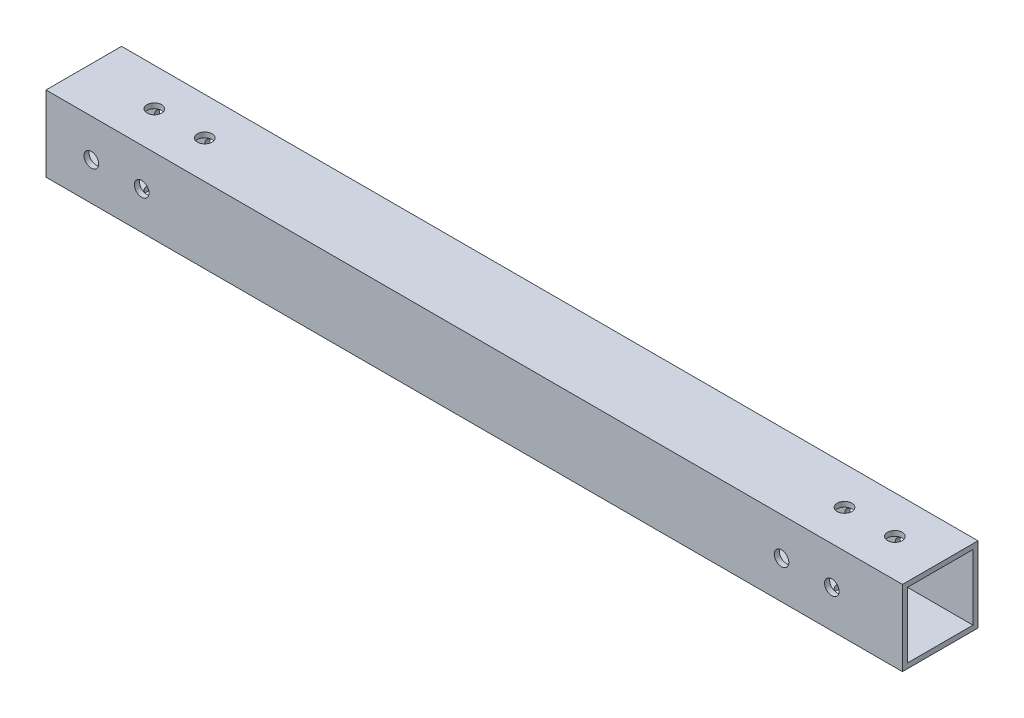
ISO-10303-21;
HEADER;
FILE_DESCRIPTION(('STEP AP214'),'2;1');
FILE_NAME('part.step','',(''),(''),'','','');
FILE_SCHEMA(('AUTOMOTIVE_DESIGN { 1 0 10303 214 1 1 1 1 }'));
ENDSEC;
DATA;
#1=APPLICATION_CONTEXT('core data for automotive mechanical design processes');
#2=APPLICATION_PROTOCOL_DEFINITION('international standard','automotive_design',2000,#1);
#3=PRODUCT_CONTEXT('',#1,'mechanical');
#4=PRODUCT('Part','Part','',(#3));
#5=PRODUCT_RELATED_PRODUCT_CATEGORY('part','',(#4));
#6=PRODUCT_DEFINITION_FORMATION('','',#4);
#7=PRODUCT_DEFINITION_CONTEXT('part definition',#1,'design');
#8=PRODUCT_DEFINITION('design','',#6,#7);
#9=PRODUCT_DEFINITION_SHAPE('','',#8);
#10=(LENGTH_UNIT() NAMED_UNIT(*) SI_UNIT(.MILLI.,.METRE.));
#11=(NAMED_UNIT(*) PLANE_ANGLE_UNIT() SI_UNIT($,.RADIAN.));
#12=(NAMED_UNIT(*) SI_UNIT($,.STERADIAN.) SOLID_ANGLE_UNIT());
#13=UNCERTAINTY_MEASURE_WITH_UNIT(LENGTH_MEASURE(1.E-05),#10,'distance_accuracy_value','');
#14=(GEOMETRIC_REPRESENTATION_CONTEXT(3) GLOBAL_UNCERTAINTY_ASSIGNED_CONTEXT((#13)) GLOBAL_UNIT_ASSIGNED_CONTEXT((#10,
#11,#12)) REPRESENTATION_CONTEXT('',''));
#15=CARTESIAN_POINT('',(0.,0.,0.));
#16=DIRECTION('',(0.,0.,1.));
#17=DIRECTION('',(1.,0.,0.));
#18=AXIS2_PLACEMENT_3D('',#15,#16,#17);
#19=CARTESIAN_POINT('',(170.,0.,0.));
#20=DIRECTION('',(-1.,0.,0.));
#21=DIRECTION('',(0.,0.,1.));
#22=AXIS2_PLACEMENT_3D('',#19,#20,#21);
#23=PLANE('',#22);
#24=DIRECTION('',(0.,1.,0.));
#25=VECTOR('',#24,1.);
#26=CARTESIAN_POINT('',(170.,-7.5,-7.5));
#27=LINE('',#26,#25);
#28=CARTESIAN_POINT('',(170.,-7.5,-7.5));
#29=VERTEX_POINT('',#28);
#30=CARTESIAN_POINT('',(170.,7.5,-7.5));
#31=VERTEX_POINT('',#30);
#32=EDGE_CURVE('E146',#29,#31,#27,.T.);
#33=ORIENTED_EDGE('',*,*,#32,.T.);
#34=DIRECTION('',(0.,0.,1.));
#35=VECTOR('',#34,1.);
#36=CARTESIAN_POINT('',(170.,7.5,7.5));
#37=LINE('',#36,#35);
#38=CARTESIAN_POINT('',(170.,7.5,7.5));
#39=VERTEX_POINT('',#38);
#40=EDGE_CURVE('E149',#31,#39,#37,.T.);
#41=ORIENTED_EDGE('',*,*,#40,.T.);
#42=DIRECTION('',(0.,-1.,0.));
#43=VECTOR('',#42,1.);
#44=CARTESIAN_POINT('',(170.,-7.5,7.5));
#45=LINE('',#44,#43);
#46=CARTESIAN_POINT('',(170.,-7.5,7.5));
#47=VERTEX_POINT('',#46);
#48=EDGE_CURVE('E152',#39,#47,#45,.T.);
#49=ORIENTED_EDGE('',*,*,#48,.T.);
#50=DIRECTION('',(0.,0.,-1.));
#51=VECTOR('',#50,1.);
#52=CARTESIAN_POINT('',(170.,-7.5,7.5));
#53=LINE('',#52,#51);
#54=EDGE_CURVE('E154',#47,#29,#53,.T.);
#55=ORIENTED_EDGE('',*,*,#54,.T.);
#56=EDGE_LOOP('',(#33,#41,#49,#55));
#57=FACE_BOUND('',#56,.T.);
#58=DIRECTION('',(0.,0.,-1.));
#59=VECTOR('',#58,1.);
#60=CARTESIAN_POINT('',(170.,-6.5,6.5));
#61=LINE('',#60,#59);
#62=CARTESIAN_POINT('',(170.,-6.5,6.5));
#63=VERTEX_POINT('',#62);
#64=CARTESIAN_POINT('',(170.,-6.5,-6.5));
#65=VERTEX_POINT('',#64);
#66=EDGE_CURVE('E108',#63,#65,#61,.T.);
#67=ORIENTED_EDGE('',*,*,#66,.F.);
#68=DIRECTION('',(0.,-1.,0.));
#69=VECTOR('',#68,1.);
#70=CARTESIAN_POINT('',(170.,-6.5,6.5));
#71=LINE('',#70,#69);
#72=CARTESIAN_POINT('',(170.,6.5,6.5));
#73=VERTEX_POINT('',#72);
#74=EDGE_CURVE('E130',#73,#63,#71,.T.);
#75=ORIENTED_EDGE('',*,*,#74,.F.);
#76=DIRECTION('',(0.,0.,1.));
#77=VECTOR('',#76,1.);
#78=CARTESIAN_POINT('',(170.,6.5,6.5));
#79=LINE('',#78,#77);
#80=CARTESIAN_POINT('',(170.,6.5,-6.5));
#81=VERTEX_POINT('',#80);
#82=EDGE_CURVE('E128',#81,#73,#79,.T.);
#83=ORIENTED_EDGE('',*,*,#82,.F.);
#84=DIRECTION('',(0.,1.,0.));
#85=VECTOR('',#84,1.);
#86=CARTESIAN_POINT('',(170.,-6.5,-6.5));
#87=LINE('',#86,#85);
#88=EDGE_CURVE('E116',#65,#81,#87,.T.);
#89=ORIENTED_EDGE('',*,*,#88,.F.);
#90=EDGE_LOOP('',(#67,#75,#83,#89));
#91=FACE_BOUND('',#90,.T.);
#92=ADVANCED_FACE('F41',(#57,#91),#23,.F.);
#93=CARTESIAN_POINT('',(0.,0.,0.));
#94=DIRECTION('',(-1.,0.,0.));
#95=DIRECTION('',(0.,0.,1.));
#96=AXIS2_PLACEMENT_3D('',#93,#94,#95);
#97=PLANE('',#96);
#98=DIRECTION('',(0.,1.,0.));
#99=VECTOR('',#98,1.);
#100=CARTESIAN_POINT('',(0.,-7.5,-7.5));
#101=LINE('',#100,#99);
#102=CARTESIAN_POINT('',(0.,-7.5,-7.5));
#103=VERTEX_POINT('',#102);
#104=CARTESIAN_POINT('',(0.,7.5,-7.5));
#105=VERTEX_POINT('',#104);
#106=EDGE_CURVE('E124',#103,#105,#101,.T.);
#107=ORIENTED_EDGE('',*,*,#106,.F.);
#108=DIRECTION('',(0.,0.,-1.));
#109=VECTOR('',#108,1.);
#110=CARTESIAN_POINT('',(0.,-7.5,7.5));
#111=LINE('',#110,#109);
#112=CARTESIAN_POINT('',(0.,-7.5,7.5));
#113=VERTEX_POINT('',#112);
#114=EDGE_CURVE('E150',#113,#103,#111,.T.);
#115=ORIENTED_EDGE('',*,*,#114,.F.);
#116=DIRECTION('',(0.,-1.,0.));
#117=VECTOR('',#116,1.);
#118=CARTESIAN_POINT('',(0.,-7.5,7.5));
#119=LINE('',#118,#117);
#120=CARTESIAN_POINT('',(0.,7.5,7.5));
#121=VERTEX_POINT('',#120);
#122=EDGE_CURVE('E161',#121,#113,#119,.T.);
#123=ORIENTED_EDGE('',*,*,#122,.F.);
#124=DIRECTION('',(0.,0.,1.));
#125=VECTOR('',#124,1.);
#126=CARTESIAN_POINT('',(0.,7.5,7.5));
#127=LINE('',#126,#125);
#128=EDGE_CURVE('E159',#105,#121,#127,.T.);
#129=ORIENTED_EDGE('',*,*,#128,.F.);
#130=EDGE_LOOP('',(#107,#115,#123,#129));
#131=FACE_BOUND('',#130,.T.);
#132=DIRECTION('',(0.,-1.,0.));
#133=VECTOR('',#132,1.);
#134=CARTESIAN_POINT('',(0.,-6.5,6.5));
#135=LINE('',#134,#133);
#136=CARTESIAN_POINT('',(0.,6.5,6.5));
#137=VERTEX_POINT('',#136);
#138=CARTESIAN_POINT('',(0.,-6.5,6.5));
#139=VERTEX_POINT('',#138);
#140=EDGE_CURVE('E117',#137,#139,#135,.T.);
#141=ORIENTED_EDGE('',*,*,#140,.T.);
#142=DIRECTION('',(0.,0.,-1.));
#143=VECTOR('',#142,1.);
#144=CARTESIAN_POINT('',(0.,-6.5,6.5));
#145=LINE('',#144,#143);
#146=CARTESIAN_POINT('',(0.,-6.5,-6.5));
#147=VERTEX_POINT('',#146);
#148=EDGE_CURVE('E66',#139,#147,#145,.T.);
#149=ORIENTED_EDGE('',*,*,#148,.T.);
#150=DIRECTION('',(0.,1.,0.));
#151=VECTOR('',#150,1.);
#152=CARTESIAN_POINT('',(0.,-6.5,-6.5));
#153=LINE('',#152,#151);
#154=CARTESIAN_POINT('',(0.,6.5,-6.5));
#155=VERTEX_POINT('',#154);
#156=EDGE_CURVE('E123',#147,#155,#153,.T.);
#157=ORIENTED_EDGE('',*,*,#156,.T.);
#158=DIRECTION('',(0.,0.,1.));
#159=VECTOR('',#158,1.);
#160=CARTESIAN_POINT('',(0.,6.5,6.5));
#161=LINE('',#160,#159);
#162=EDGE_CURVE('E138',#155,#137,#161,.T.);
#163=ORIENTED_EDGE('',*,*,#162,.T.);
#164=EDGE_LOOP('',(#141,#149,#157,#163));
#165=FACE_BOUND('',#164,.T.);
#166=ADVANCED_FACE('F268',(#131,#165),#97,.T.);
#167=CARTESIAN_POINT('',(170.,-7.5,-7.5));
#168=DIRECTION('',(0.,0.,1.));
#169=DIRECTION('',(1.,0.,0.));
#170=AXIS2_PLACEMENT_3D('',#167,#168,#169);
#171=PLANE('',#170);
#172=CARTESIAN_POINT('',(8.99999999999831,2.80157841370254E-13,-7.5));
#173=DIRECTION('',(0.,0.,-1.));
#174=DIRECTION('',(-1.,0.,0.));
#175=AXIS2_PLACEMENT_3D('',#172,#173,#174);
#176=CIRCLE('',#175,1.45);
#177=CARTESIAN_POINT('',(7.54999999999831,2.80157841370254E-13,-7.5));
#178=VERTEX_POINT('',#177);
#179=EDGE_CURVE('E215',#178,#178,#176,.T.);
#180=ORIENTED_EDGE('',*,*,#179,.F.);
#181=EDGE_LOOP('',(#180));
#182=FACE_BOUND('',#181,.T.);
#183=CARTESIAN_POINT('',(18.9999999999983,2.80157841370254E-13,-7.5));
#184=DIRECTION('',(0.,0.,-1.));
#185=DIRECTION('',(-1.,0.,0.));
#186=AXIS2_PLACEMENT_3D('',#183,#184,#185);
#187=CIRCLE('',#186,1.45);
#188=CARTESIAN_POINT('',(17.5499999999983,2.80157841370254E-13,-7.5));
#189=VERTEX_POINT('',#188);
#190=EDGE_CURVE('E218',#189,#189,#187,.T.);
#191=ORIENTED_EDGE('',*,*,#190,.F.);
#192=EDGE_LOOP('',(#191));
#193=FACE_BOUND('',#192,.T.);
#194=CARTESIAN_POINT('',(146.,2.8275992658422E-13,-7.5));
#195=DIRECTION('',(0.,0.,-1.));
#196=DIRECTION('',(-1.,0.,0.));
#197=AXIS2_PLACEMENT_3D('',#194,#195,#196);
#198=CIRCLE('',#197,1.45);
#199=CARTESIAN_POINT('',(144.55,2.8275992658422E-13,-7.5));
#200=VERTEX_POINT('',#199);
#201=EDGE_CURVE('E224',#200,#200,#198,.T.);
#202=ORIENTED_EDGE('',*,*,#201,.F.);
#203=EDGE_LOOP('',(#202));
#204=FACE_BOUND('',#203,.T.);
#205=CARTESIAN_POINT('',(156.,2.8275992658422E-13,-7.5));
#206=DIRECTION('',(0.,0.,-1.));
#207=DIRECTION('',(-1.,0.,0.));
#208=AXIS2_PLACEMENT_3D('',#205,#206,#207);
#209=CIRCLE('',#208,1.45);
#210=CARTESIAN_POINT('',(154.55,2.8275992658422E-13,-7.5));
#211=VERTEX_POINT('',#210);
#212=EDGE_CURVE('E230',#211,#211,#209,.T.);
#213=ORIENTED_EDGE('',*,*,#212,.F.);
#214=EDGE_LOOP('',(#213));
#215=FACE_BOUND('',#214,.T.);
#216=ORIENTED_EDGE('',*,*,#106,.T.);
#217=DIRECTION('',(-1.,0.,0.));
#218=VECTOR('',#217,1.);
#219=CARTESIAN_POINT('',(170.,7.5,-7.5));
#220=LINE('',#219,#218);
#221=EDGE_CURVE('E11',#31,#105,#220,.T.);
#222=ORIENTED_EDGE('',*,*,#221,.F.);
#223=ORIENTED_EDGE('',*,*,#32,.F.);
#224=DIRECTION('',(-1.,0.,0.));
#225=VECTOR('',#224,1.);
#226=CARTESIAN_POINT('',(170.,-7.5,-7.5));
#227=LINE('',#226,#225);
#228=EDGE_CURVE('E156',#29,#103,#227,.T.);
#229=ORIENTED_EDGE('',*,*,#228,.T.);
#230=EDGE_LOOP('',(#216,#222,#223,#229));
#231=FACE_BOUND('',#230,.T.);
#232=ADVANCED_FACE('F43',(#182,#193,#204,#215,#231),#171,.F.);
#233=CARTESIAN_POINT('',(170.,7.5,7.5));
#234=DIRECTION('',(0.,-1.,0.));
#235=DIRECTION('',(0.,0.,-1.));
#236=AXIS2_PLACEMENT_3D('',#233,#234,#235);
#237=PLANE('',#236);
#238=CARTESIAN_POINT('',(161.,7.5,-4.32986979603811E-12));
#239=DIRECTION('',(0.,1.,0.));
#240=DIRECTION('',(0.,0.,1.));
#241=AXIS2_PLACEMENT_3D('',#238,#239,#240);
#242=CIRCLE('',#241,1.45);
#243=CARTESIAN_POINT('',(161.,7.5,1.44999999999567));
#244=VERTEX_POINT('',#243);
#245=EDGE_CURVE('E364',#244,#244,#242,.T.);
#246=ORIENTED_EDGE('',*,*,#245,.F.);
#247=EDGE_LOOP('',(#246));
#248=FACE_BOUND('',#247,.T.);
#249=CARTESIAN_POINT('',(151.,7.5,-4.32553298734817E-12));
#250=DIRECTION('',(0.,1.,0.));
#251=DIRECTION('',(0.,0.,1.));
#252=AXIS2_PLACEMENT_3D('',#249,#250,#251);
#253=CIRCLE('',#252,1.45);
#254=CARTESIAN_POINT('',(151.,7.5,1.44999999999567));
#255=VERTEX_POINT('',#254);
#256=EDGE_CURVE('E372',#255,#255,#253,.T.);
#257=ORIENTED_EDGE('',*,*,#256,.F.);
#258=EDGE_LOOP('',(#257));
#259=FACE_BOUND('',#258,.T.);
#260=CARTESIAN_POINT('',(23.9999999999981,7.5,-4.23185791964542E-12));
#261=DIRECTION('',(0.,1.,0.));
#262=DIRECTION('',(0.,0.,1.));
#263=AXIS2_PLACEMENT_3D('',#260,#261,#262);
#264=CIRCLE('',#263,1.45);
#265=CARTESIAN_POINT('',(23.9999999999981,7.5,1.44999999999577));
#266=VERTEX_POINT('',#265);
#267=EDGE_CURVE('E378',#266,#266,#264,.T.);
#268=ORIENTED_EDGE('',*,*,#267,.F.);
#269=EDGE_LOOP('',(#268));
#270=FACE_BOUND('',#269,.T.);
#271=CARTESIAN_POINT('',(13.9999999999981,7.5,-4.23099055790743E-12));
#272=DIRECTION('',(0.,1.,0.));
#273=DIRECTION('',(0.,0.,1.));
#274=AXIS2_PLACEMENT_3D('',#271,#272,#273);
#275=CIRCLE('',#274,1.45);
#276=CARTESIAN_POINT('',(13.9999999999981,7.5,1.44999999999577));
#277=VERTEX_POINT('',#276);
#278=EDGE_CURVE('E383',#277,#277,#275,.T.);
#279=ORIENTED_EDGE('',*,*,#278,.F.);
#280=EDGE_LOOP('',(#279));
#281=FACE_BOUND('',#280,.T.);
#282=ORIENTED_EDGE('',*,*,#128,.T.);
#283=DIRECTION('',(-1.,0.,0.));
#284=VECTOR('',#283,1.);
#285=CARTESIAN_POINT('',(170.,7.5,7.5));
#286=LINE('',#285,#284);
#287=EDGE_CURVE('E50',#39,#121,#286,.T.);
#288=ORIENTED_EDGE('',*,*,#287,.F.);
#289=ORIENTED_EDGE('',*,*,#40,.F.);
#290=ORIENTED_EDGE('',*,*,#221,.T.);
#291=EDGE_LOOP('',(#282,#288,#289,#290));
#292=FACE_BOUND('',#291,.T.);
#293=ADVANCED_FACE('F267',(#248,#259,#270,#281,#292),#237,.F.);
#294=CARTESIAN_POINT('',(170.,-7.5,7.5));
#295=DIRECTION('',(0.,0.,-1.));
#296=DIRECTION('',(-1.,0.,0.));
#297=AXIS2_PLACEMENT_3D('',#294,#295,#296);
#298=PLANE('',#297);
#299=CARTESIAN_POINT('',(8.99999999999831,2.80157841370254E-13,7.5));
#300=DIRECTION('',(0.,0.,-1.));
#301=DIRECTION('',(-1.,0.,0.));
#302=AXIS2_PLACEMENT_3D('',#299,#300,#301);
#303=CIRCLE('',#302,1.45);
#304=CARTESIAN_POINT('',(7.54999999999831,2.80157841370254E-13,7.5));
#305=VERTEX_POINT('',#304);
#306=EDGE_CURVE('E175',#305,#305,#303,.T.);
#307=ORIENTED_EDGE('',*,*,#306,.T.);
#308=EDGE_LOOP('',(#307));
#309=FACE_BOUND('',#308,.T.);
#310=CARTESIAN_POINT('',(18.9999999999983,2.80157841370254E-13,7.5));
#311=DIRECTION('',(0.,0.,-1.));
#312=DIRECTION('',(-1.,0.,0.));
#313=AXIS2_PLACEMENT_3D('',#310,#311,#312);
#314=CIRCLE('',#313,1.45);
#315=CARTESIAN_POINT('',(17.5499999999983,2.80157841370254E-13,7.5));
#316=VERTEX_POINT('',#315);
#317=EDGE_CURVE('E221',#316,#316,#314,.T.);
#318=ORIENTED_EDGE('',*,*,#317,.T.);
#319=EDGE_LOOP('',(#318));
#320=FACE_BOUND('',#319,.T.);
#321=CARTESIAN_POINT('',(146.,2.8275992658422E-13,7.5));
#322=DIRECTION('',(0.,0.,-1.));
#323=DIRECTION('',(-1.,0.,0.));
#324=AXIS2_PLACEMENT_3D('',#321,#322,#323);
#325=CIRCLE('',#324,1.45);
#326=CARTESIAN_POINT('',(144.55,2.8275992658422E-13,7.5));
#327=VERTEX_POINT('',#326);
#328=EDGE_CURVE('E227',#327,#327,#325,.T.);
#329=ORIENTED_EDGE('',*,*,#328,.T.);
#330=EDGE_LOOP('',(#329));
#331=FACE_BOUND('',#330,.T.);
#332=CARTESIAN_POINT('',(156.,2.8275992658422E-13,7.5));
#333=DIRECTION('',(0.,0.,-1.));
#334=DIRECTION('',(-1.,0.,0.));
#335=AXIS2_PLACEMENT_3D('',#332,#333,#334);
#336=CIRCLE('',#335,1.45);
#337=CARTESIAN_POINT('',(154.55,2.8275992658422E-13,7.5));
#338=VERTEX_POINT('',#337);
#339=EDGE_CURVE('E212',#338,#338,#336,.T.);
#340=ORIENTED_EDGE('',*,*,#339,.T.);
#341=EDGE_LOOP('',(#340));
#342=FACE_BOUND('',#341,.T.);
#343=ORIENTED_EDGE('',*,*,#122,.T.);
#344=DIRECTION('',(-1.,0.,0.));
#345=VECTOR('',#344,1.);
#346=CARTESIAN_POINT('',(170.,-7.5,7.5));
#347=LINE('',#346,#345);
#348=EDGE_CURVE('E166',#47,#113,#347,.T.);
#349=ORIENTED_EDGE('',*,*,#348,.F.);
#350=ORIENTED_EDGE('',*,*,#48,.F.);
#351=ORIENTED_EDGE('',*,*,#287,.T.);
#352=EDGE_LOOP('',(#343,#349,#350,#351));
#353=FACE_BOUND('',#352,.T.);
#354=ADVANCED_FACE('F287',(#309,#320,#331,#342,#353),#298,.F.);
#355=CARTESIAN_POINT('',(170.,-7.5,7.5));
#356=DIRECTION('',(0.,1.,0.));
#357=DIRECTION('',(0.,0.,1.));
#358=AXIS2_PLACEMENT_3D('',#355,#356,#357);
#359=PLANE('',#358);
#360=CARTESIAN_POINT('',(161.,-7.5,-4.32986979603811E-12));
#361=DIRECTION('',(0.,1.,0.));
#362=DIRECTION('',(0.,0.,1.));
#363=AXIS2_PLACEMENT_3D('',#360,#361,#362);
#364=CIRCLE('',#363,1.45);
#365=CARTESIAN_POINT('',(161.,-7.5,1.44999999999567));
#366=VERTEX_POINT('',#365);
#367=EDGE_CURVE('E191',#366,#366,#364,.T.);
#368=ORIENTED_EDGE('',*,*,#367,.T.);
#369=EDGE_LOOP('',(#368));
#370=FACE_BOUND('',#369,.T.);
#371=CARTESIAN_POINT('',(151.,-7.5,-4.32553298734817E-12));
#372=DIRECTION('',(0.,1.,0.));
#373=DIRECTION('',(0.,0.,1.));
#374=AXIS2_PLACEMENT_3D('',#371,#372,#373);
#375=CIRCLE('',#374,1.45);
#376=CARTESIAN_POINT('',(151.,-7.5,1.44999999999567));
#377=VERTEX_POINT('',#376);
#378=EDGE_CURVE('E367',#377,#377,#375,.T.);
#379=ORIENTED_EDGE('',*,*,#378,.T.);
#380=EDGE_LOOP('',(#379));
#381=FACE_BOUND('',#380,.T.);
#382=CARTESIAN_POINT('',(23.9999999999981,-7.5,-4.23185791964542E-12));
#383=DIRECTION('',(0.,1.,0.));
#384=DIRECTION('',(0.,0.,1.));
#385=AXIS2_PLACEMENT_3D('',#382,#383,#384);
#386=CIRCLE('',#385,1.45);
#387=CARTESIAN_POINT('',(23.9999999999981,-7.5,1.44999999999577));
#388=VERTEX_POINT('',#387);
#389=EDGE_CURVE('E375',#388,#388,#386,.T.);
#390=ORIENTED_EDGE('',*,*,#389,.T.);
#391=EDGE_LOOP('',(#390));
#392=FACE_BOUND('',#391,.T.);
#393=CARTESIAN_POINT('',(13.9999999999981,-7.5,-4.23099055790743E-12));
#394=DIRECTION('',(0.,1.,0.));
#395=DIRECTION('',(0.,0.,1.));
#396=AXIS2_PLACEMENT_3D('',#393,#394,#395);
#397=CIRCLE('',#396,1.45);
#398=CARTESIAN_POINT('',(13.9999999999981,-7.5,1.44999999999577));
#399=VERTEX_POINT('',#398);
#400=EDGE_CURVE('E381',#399,#399,#397,.T.);
#401=ORIENTED_EDGE('',*,*,#400,.T.);
#402=EDGE_LOOP('',(#401));
#403=FACE_BOUND('',#402,.T.);
#404=ORIENTED_EDGE('',*,*,#114,.T.);
#405=ORIENTED_EDGE('',*,*,#228,.F.);
#406=ORIENTED_EDGE('',*,*,#54,.F.);
#407=ORIENTED_EDGE('',*,*,#348,.T.);
#408=EDGE_LOOP('',(#404,#405,#406,#407));
#409=FACE_BOUND('',#408,.T.);
#410=ADVANCED_FACE('F285',(#370,#381,#392,#403,#409),#359,.F.);
#411=CARTESIAN_POINT('',(170.,-6.5,6.5));
#412=DIRECTION('',(0.,1.,0.));
#413=DIRECTION('',(0.,0.,1.));
#414=AXIS2_PLACEMENT_3D('',#411,#412,#413);
#415=PLANE('',#414);
#416=CARTESIAN_POINT('',(161.,-6.5,-4.32986979603811E-12));
#417=DIRECTION('',(0.,1.,0.));
#418=DIRECTION('',(0.,0.,1.));
#419=AXIS2_PLACEMENT_3D('',#416,#417,#418);
#420=CIRCLE('',#419,1.45);
#421=CARTESIAN_POINT('',(161.,-6.5,1.44999999999567));
#422=VERTEX_POINT('',#421);
#423=EDGE_CURVE('E209',#422,#422,#420,.T.);
#424=ORIENTED_EDGE('',*,*,#423,.F.);
#425=EDGE_LOOP('',(#424));
#426=FACE_BOUND('',#425,.T.);
#427=CARTESIAN_POINT('',(151.,-6.5,-4.32553298734817E-12));
#428=DIRECTION('',(0.,1.,0.));
#429=DIRECTION('',(0.,0.,1.));
#430=AXIS2_PLACEMENT_3D('',#427,#428,#429);
#431=CIRCLE('',#430,1.45);
#432=CARTESIAN_POINT('',(151.,-6.5,1.44999999999567));
#433=VERTEX_POINT('',#432);
#434=EDGE_CURVE('E197',#433,#433,#431,.T.);
#435=ORIENTED_EDGE('',*,*,#434,.F.);
#436=EDGE_LOOP('',(#435));
#437=FACE_BOUND('',#436,.T.);
#438=CARTESIAN_POINT('',(23.9999999999981,-6.5,-4.23185791964542E-12));
#439=DIRECTION('',(0.,1.,0.));
#440=DIRECTION('',(0.,0.,1.));
#441=AXIS2_PLACEMENT_3D('',#438,#439,#440);
#442=CIRCLE('',#441,1.45);
#443=CARTESIAN_POINT('',(23.9999999999981,-6.5,1.44999999999577));
#444=VERTEX_POINT('',#443);
#445=EDGE_CURVE('E194',#444,#444,#442,.T.);
#446=ORIENTED_EDGE('',*,*,#445,.F.);
#447=EDGE_LOOP('',(#446));
#448=FACE_BOUND('',#447,.T.);
#449=CARTESIAN_POINT('',(13.9999999999981,-6.5,-4.23099055790743E-12));
#450=DIRECTION('',(0.,1.,0.));
#451=DIRECTION('',(0.,0.,1.));
#452=AXIS2_PLACEMENT_3D('',#449,#450,#451);
#453=CIRCLE('',#452,1.45);
#454=CARTESIAN_POINT('',(13.9999999999981,-6.5,1.44999999999577));
#455=VERTEX_POINT('',#454);
#456=EDGE_CURVE('E190',#455,#455,#453,.T.);
#457=ORIENTED_EDGE('',*,*,#456,.F.);
#458=EDGE_LOOP('',(#457));
#459=FACE_BOUND('',#458,.T.);
#460=ORIENTED_EDGE('',*,*,#148,.F.);
#461=DIRECTION('',(-1.,0.,0.));
#462=VECTOR('',#461,1.);
#463=CARTESIAN_POINT('',(170.,-6.5,6.5));
#464=LINE('',#463,#462);
#465=EDGE_CURVE('E112',#63,#139,#464,.T.);
#466=ORIENTED_EDGE('',*,*,#465,.F.);
#467=ORIENTED_EDGE('',*,*,#66,.T.);
#468=DIRECTION('',(-1.,0.,0.));
#469=VECTOR('',#468,1.);
#470=CARTESIAN_POINT('',(170.,-6.5,-6.5));
#471=LINE('',#470,#469);
#472=EDGE_CURVE('E111',#65,#147,#471,.T.);
#473=ORIENTED_EDGE('',*,*,#472,.T.);
#474=EDGE_LOOP('',(#460,#466,#467,#473));
#475=FACE_BOUND('',#474,.T.);
#476=ADVANCED_FACE('F110',(#426,#437,#448,#459,#475),#415,.T.);
#477=CARTESIAN_POINT('',(170.,-6.5,-6.5));
#478=DIRECTION('',(0.,0.,1.));
#479=DIRECTION('',(0.,-1.,0.));
#480=AXIS2_PLACEMENT_3D('',#477,#478,#479);
#481=PLANE('',#480);
#482=CARTESIAN_POINT('',(8.99999999999831,2.80157841370254E-13,-6.5));
#483=DIRECTION('',(0.,0.,1.));
#484=DIRECTION('',(0.,-1.,0.));
#485=AXIS2_PLACEMENT_3D('',#482,#483,#484);
#486=CIRCLE('',#485,1.45);
#487=CARTESIAN_POINT('',(8.99999999999831,-1.44999999999972,-6.5));
#488=VERTEX_POINT('',#487);
#489=EDGE_CURVE('E136',#488,#488,#486,.T.);
#490=ORIENTED_EDGE('',*,*,#489,.F.);
#491=EDGE_LOOP('',(#490));
#492=FACE_BOUND('',#491,.T.);
#493=CARTESIAN_POINT('',(18.9999999999983,2.80157841370254E-13,-6.5));
#494=DIRECTION('',(0.,0.,1.));
#495=DIRECTION('',(0.,-1.,0.));
#496=AXIS2_PLACEMENT_3D('',#493,#494,#495);
#497=CIRCLE('',#496,1.45);
#498=CARTESIAN_POINT('',(18.9999999999983,-1.44999999999972,-6.5));
#499=VERTEX_POINT('',#498);
#500=EDGE_CURVE('E183',#499,#499,#497,.T.);
#501=ORIENTED_EDGE('',*,*,#500,.F.);
#502=EDGE_LOOP('',(#501));
#503=FACE_BOUND('',#502,.T.);
#504=CARTESIAN_POINT('',(146.,2.8275992658422E-13,-6.5));
#505=DIRECTION('',(0.,0.,1.));
#506=DIRECTION('',(0.,-1.,0.));
#507=AXIS2_PLACEMENT_3D('',#504,#505,#506);
#508=CIRCLE('',#507,1.45);
#509=CARTESIAN_POINT('',(146.,-1.44999999999972,-6.5));
#510=VERTEX_POINT('',#509);
#511=EDGE_CURVE('E179',#510,#510,#508,.T.);
#512=ORIENTED_EDGE('',*,*,#511,.F.);
#513=EDGE_LOOP('',(#512));
#514=FACE_BOUND('',#513,.T.);
#515=CARTESIAN_POINT('',(156.,2.8275992658422E-13,-6.5));
#516=DIRECTION('',(0.,0.,1.));
#517=DIRECTION('',(0.,-1.,0.));
#518=AXIS2_PLACEMENT_3D('',#515,#516,#517);
#519=CIRCLE('',#518,1.45);
#520=CARTESIAN_POINT('',(156.,-1.44999999999972,-6.5));
#521=VERTEX_POINT('',#520);
#522=EDGE_CURVE('E174',#521,#521,#519,.T.);
#523=ORIENTED_EDGE('',*,*,#522,.F.);
#524=EDGE_LOOP('',(#523));
#525=FACE_BOUND('',#524,.T.);
#526=ORIENTED_EDGE('',*,*,#156,.F.);
#527=ORIENTED_EDGE('',*,*,#472,.F.);
#528=ORIENTED_EDGE('',*,*,#88,.T.);
#529=DIRECTION('',(-1.,0.,0.));
#530=VECTOR('',#529,1.);
#531=CARTESIAN_POINT('',(170.,6.5,-6.5));
#532=LINE('',#531,#530);
#533=EDGE_CURVE('E125',#81,#155,#532,.T.);
#534=ORIENTED_EDGE('',*,*,#533,.T.);
#535=EDGE_LOOP('',(#526,#527,#528,#534));
#536=FACE_BOUND('',#535,.T.);
#537=ADVANCED_FACE('F120',(#492,#503,#514,#525,#536),#481,.T.);
#538=CARTESIAN_POINT('',(170.,6.5,6.5));
#539=DIRECTION('',(0.,-1.,0.));
#540=DIRECTION('',(0.,0.,-1.));
#541=AXIS2_PLACEMENT_3D('',#538,#539,#540);
#542=PLANE('',#541);
#543=CARTESIAN_POINT('',(161.,6.5,-4.32986979603811E-12));
#544=DIRECTION('',(0.,-1.,0.));
#545=DIRECTION('',(0.,0.,-1.));
#546=AXIS2_PLACEMENT_3D('',#543,#544,#545);
#547=CIRCLE('',#546,1.45);
#548=CARTESIAN_POINT('',(161.,6.5,-1.45000000000433));
#549=VERTEX_POINT('',#548);
#550=EDGE_CURVE('E45',#549,#549,#547,.T.);
#551=ORIENTED_EDGE('',*,*,#550,.F.);
#552=EDGE_LOOP('',(#551));
#553=FACE_BOUND('',#552,.T.);
#554=CARTESIAN_POINT('',(151.,6.5,-4.32553298734817E-12));
#555=DIRECTION('',(0.,-1.,0.));
#556=DIRECTION('',(0.,0.,-1.));
#557=AXIS2_PLACEMENT_3D('',#554,#555,#556);
#558=CIRCLE('',#557,1.45);
#559=CARTESIAN_POINT('',(151.,6.5,-1.45000000000433));
#560=VERTEX_POINT('',#559);
#561=EDGE_CURVE('E195',#560,#560,#558,.T.);
#562=ORIENTED_EDGE('',*,*,#561,.F.);
#563=EDGE_LOOP('',(#562));
#564=FACE_BOUND('',#563,.T.);
#565=CARTESIAN_POINT('',(23.9999999999981,6.5,-4.23185791964542E-12));
#566=DIRECTION('',(0.,-1.,0.));
#567=DIRECTION('',(0.,0.,-1.));
#568=AXIS2_PLACEMENT_3D('',#565,#566,#567);
#569=CIRCLE('',#568,1.45);
#570=CARTESIAN_POINT('',(23.9999999999981,6.5,-1.45000000000423));
#571=VERTEX_POINT('',#570);
#572=EDGE_CURVE('E192',#571,#571,#569,.T.);
#573=ORIENTED_EDGE('',*,*,#572,.F.);
#574=EDGE_LOOP('',(#573));
#575=FACE_BOUND('',#574,.T.);
#576=CARTESIAN_POINT('',(13.9999999999981,6.5,-4.23099055790743E-12));
#577=DIRECTION('',(0.,-1.,0.));
#578=DIRECTION('',(0.,0.,-1.));
#579=AXIS2_PLACEMENT_3D('',#576,#577,#578);
#580=CIRCLE('',#579,1.45);
#581=CARTESIAN_POINT('',(13.9999999999981,6.5,-1.45000000000423));
#582=VERTEX_POINT('',#581);
#583=EDGE_CURVE('E187',#582,#582,#580,.T.);
#584=ORIENTED_EDGE('',*,*,#583,.F.);
#585=EDGE_LOOP('',(#584));
#586=FACE_BOUND('',#585,.T.);
#587=ORIENTED_EDGE('',*,*,#162,.F.);
#588=ORIENTED_EDGE('',*,*,#533,.F.);
#589=ORIENTED_EDGE('',*,*,#82,.T.);
#590=DIRECTION('',(-1.,0.,0.));
#591=VECTOR('',#590,1.);
#592=CARTESIAN_POINT('',(170.,6.5,6.5));
#593=LINE('',#592,#591);
#594=EDGE_CURVE('E58',#73,#137,#593,.T.);
#595=ORIENTED_EDGE('',*,*,#594,.T.);
#596=EDGE_LOOP('',(#587,#588,#589,#595));
#597=FACE_BOUND('',#596,.T.);
#598=ADVANCED_FACE('F248',(#553,#564,#575,#586,#597),#542,.T.);
#599=CARTESIAN_POINT('',(170.,-6.5,6.5));
#600=DIRECTION('',(0.,0.,-1.));
#601=DIRECTION('',(-1.,0.,0.));
#602=AXIS2_PLACEMENT_3D('',#599,#600,#601);
#603=PLANE('',#602);
#604=CARTESIAN_POINT('',(8.99999999999831,2.80157841370254E-13,6.5));
#605=DIRECTION('',(0.,0.,-1.));
#606=DIRECTION('',(-1.,0.,0.));
#607=AXIS2_PLACEMENT_3D('',#604,#605,#606);
#608=CIRCLE('',#607,1.45);
#609=CARTESIAN_POINT('',(7.54999999999831,2.80157841370254E-13,6.5));
#610=VERTEX_POINT('',#609);
#611=EDGE_CURVE('E184',#610,#610,#608,.T.);
#612=ORIENTED_EDGE('',*,*,#611,.F.);
#613=EDGE_LOOP('',(#612));
#614=FACE_BOUND('',#613,.T.);
#615=CARTESIAN_POINT('',(18.9999999999983,2.80157841370254E-13,6.5));
#616=DIRECTION('',(0.,0.,-1.));
#617=DIRECTION('',(-1.,0.,0.));
#618=AXIS2_PLACEMENT_3D('',#615,#616,#617);
#619=CIRCLE('',#618,1.45);
#620=CARTESIAN_POINT('',(17.5499999999983,2.80157841370254E-13,6.5));
#621=VERTEX_POINT('',#620);
#622=EDGE_CURVE('E180',#621,#621,#619,.T.);
#623=ORIENTED_EDGE('',*,*,#622,.F.);
#624=EDGE_LOOP('',(#623));
#625=FACE_BOUND('',#624,.T.);
#626=CARTESIAN_POINT('',(146.,2.8275992658422E-13,6.5));
#627=DIRECTION('',(0.,0.,-1.));
#628=DIRECTION('',(-1.,0.,0.));
#629=AXIS2_PLACEMENT_3D('',#626,#627,#628);
#630=CIRCLE('',#629,1.45);
#631=CARTESIAN_POINT('',(144.55,2.8275992658422E-13,6.5));
#632=VERTEX_POINT('',#631);
#633=EDGE_CURVE('E176',#632,#632,#630,.T.);
#634=ORIENTED_EDGE('',*,*,#633,.F.);
#635=EDGE_LOOP('',(#634));
#636=FACE_BOUND('',#635,.T.);
#637=CARTESIAN_POINT('',(156.,2.8275992658422E-13,6.5));
#638=DIRECTION('',(0.,0.,-1.));
#639=DIRECTION('',(-1.,0.,0.));
#640=AXIS2_PLACEMENT_3D('',#637,#638,#639);
#641=CIRCLE('',#640,1.45);
#642=CARTESIAN_POINT('',(154.55,2.8275992658422E-13,6.5));
#643=VERTEX_POINT('',#642);
#644=EDGE_CURVE('E171',#643,#643,#641,.T.);
#645=ORIENTED_EDGE('',*,*,#644,.F.);
#646=EDGE_LOOP('',(#645));
#647=FACE_BOUND('',#646,.T.);
#648=ORIENTED_EDGE('',*,*,#140,.F.);
#649=ORIENTED_EDGE('',*,*,#594,.F.);
#650=ORIENTED_EDGE('',*,*,#74,.T.);
#651=ORIENTED_EDGE('',*,*,#465,.T.);
#652=EDGE_LOOP('',(#648,#649,#650,#651));
#653=FACE_BOUND('',#652,.T.);
#654=ADVANCED_FACE('F311',(#614,#625,#636,#647,#653),#603,.T.);
#655=CARTESIAN_POINT('',(156.,2.8275992658422E-13,7.5));
#656=DIRECTION('',(0.,0.,-1.));
#657=DIRECTION('',(-1.,0.,0.));
#658=AXIS2_PLACEMENT_3D('',#655,#656,#657);
#659=CYLINDRICAL_SURFACE('',#658,1.45);
#660=ORIENTED_EDGE('',*,*,#644,.T.);
#661=EDGE_LOOP('',(#660));
#662=FACE_BOUND('',#661,.T.);
#663=ORIENTED_EDGE('',*,*,#339,.F.);
#664=EDGE_LOOP('',(#663));
#665=FACE_BOUND('',#664,.T.);
#666=ADVANCED_FACE('F262',(#662,#665),#659,.F.);
#667=CARTESIAN_POINT('',(146.,2.8275992658422E-13,7.5));
#668=DIRECTION('',(0.,0.,-1.));
#669=DIRECTION('',(-1.,0.,0.));
#670=AXIS2_PLACEMENT_3D('',#667,#668,#669);
#671=CYLINDRICAL_SURFACE('',#670,1.45);
#672=ORIENTED_EDGE('',*,*,#633,.T.);
#673=EDGE_LOOP('',(#672));
#674=FACE_BOUND('',#673,.T.);
#675=ORIENTED_EDGE('',*,*,#328,.F.);
#676=EDGE_LOOP('',(#675));
#677=FACE_BOUND('',#676,.T.);
#678=ADVANCED_FACE('F317',(#674,#677),#671,.F.);
#679=CARTESIAN_POINT('',(18.9999999999983,2.80157841370254E-13,7.5));
#680=DIRECTION('',(0.,0.,-1.));
#681=DIRECTION('',(-1.,0.,0.));
#682=AXIS2_PLACEMENT_3D('',#679,#680,#681);
#683=CYLINDRICAL_SURFACE('',#682,1.45);
#684=ORIENTED_EDGE('',*,*,#622,.T.);
#685=EDGE_LOOP('',(#684));
#686=FACE_BOUND('',#685,.T.);
#687=ORIENTED_EDGE('',*,*,#317,.F.);
#688=EDGE_LOOP('',(#687));
#689=FACE_BOUND('',#688,.T.);
#690=ADVANCED_FACE('F321',(#686,#689),#683,.F.);
#691=CARTESIAN_POINT('',(8.99999999999831,2.80157841370254E-13,7.5));
#692=DIRECTION('',(0.,0.,-1.));
#693=DIRECTION('',(-1.,0.,0.));
#694=AXIS2_PLACEMENT_3D('',#691,#692,#693);
#695=CYLINDRICAL_SURFACE('',#694,1.45);
#696=ORIENTED_EDGE('',*,*,#611,.T.);
#697=EDGE_LOOP('',(#696));
#698=FACE_BOUND('',#697,.T.);
#699=ORIENTED_EDGE('',*,*,#306,.F.);
#700=EDGE_LOOP('',(#699));
#701=FACE_BOUND('',#700,.T.);
#702=ADVANCED_FACE('F260',(#698,#701),#695,.F.);
#703=ORIENTED_EDGE('',*,*,#522,.T.);
#704=EDGE_LOOP('',(#703));
#705=FACE_BOUND('',#704,.T.);
#706=ORIENTED_EDGE('',*,*,#212,.T.);
#707=EDGE_LOOP('',(#706));
#708=FACE_BOUND('',#707,.T.);
#709=ADVANCED_FACE('F256',(#705,#708),#659,.F.);
#710=ORIENTED_EDGE('',*,*,#511,.T.);
#711=EDGE_LOOP('',(#710));
#712=FACE_BOUND('',#711,.T.);
#713=ORIENTED_EDGE('',*,*,#201,.T.);
#714=EDGE_LOOP('',(#713));
#715=FACE_BOUND('',#714,.T.);
#716=ADVANCED_FACE('F259',(#712,#715),#671,.F.);
#717=ORIENTED_EDGE('',*,*,#500,.T.);
#718=EDGE_LOOP('',(#717));
#719=FACE_BOUND('',#718,.T.);
#720=ORIENTED_EDGE('',*,*,#190,.T.);
#721=EDGE_LOOP('',(#720));
#722=FACE_BOUND('',#721,.T.);
#723=ADVANCED_FACE('F326',(#719,#722),#683,.F.);
#724=ORIENTED_EDGE('',*,*,#489,.T.);
#725=EDGE_LOOP('',(#724));
#726=FACE_BOUND('',#725,.T.);
#727=ORIENTED_EDGE('',*,*,#179,.T.);
#728=EDGE_LOOP('',(#727));
#729=FACE_BOUND('',#728,.T.);
#730=ADVANCED_FACE('F243',(#726,#729),#695,.F.);
#731=CARTESIAN_POINT('',(13.9999999999981,-7.5,-4.23099055790743E-12));
#732=DIRECTION('',(0.,1.,0.));
#733=DIRECTION('',(0.,0.,1.));
#734=AXIS2_PLACEMENT_3D('',#731,#732,#733);
#735=CYLINDRICAL_SURFACE('',#734,1.45);
#736=ORIENTED_EDGE('',*,*,#583,.T.);
#737=EDGE_LOOP('',(#736));
#738=FACE_BOUND('',#737,.T.);
#739=ORIENTED_EDGE('',*,*,#278,.T.);
#740=EDGE_LOOP('',(#739));
#741=FACE_BOUND('',#740,.T.);
#742=ADVANCED_FACE('F330',(#738,#741),#735,.F.);
#743=CARTESIAN_POINT('',(23.9999999999981,-7.5,-4.23185791964542E-12));
#744=DIRECTION('',(0.,1.,0.));
#745=DIRECTION('',(0.,0.,1.));
#746=AXIS2_PLACEMENT_3D('',#743,#744,#745);
#747=CYLINDRICAL_SURFACE('',#746,1.45);
#748=ORIENTED_EDGE('',*,*,#572,.T.);
#749=EDGE_LOOP('',(#748));
#750=FACE_BOUND('',#749,.T.);
#751=ORIENTED_EDGE('',*,*,#267,.T.);
#752=EDGE_LOOP('',(#751));
#753=FACE_BOUND('',#752,.T.);
#754=ADVANCED_FACE('F333',(#750,#753),#747,.F.);
#755=CARTESIAN_POINT('',(151.,-7.5,-4.32553298734817E-12));
#756=DIRECTION('',(0.,1.,0.));
#757=DIRECTION('',(0.,0.,1.));
#758=AXIS2_PLACEMENT_3D('',#755,#756,#757);
#759=CYLINDRICAL_SURFACE('',#758,1.45);
#760=ORIENTED_EDGE('',*,*,#561,.T.);
#761=EDGE_LOOP('',(#760));
#762=FACE_BOUND('',#761,.T.);
#763=ORIENTED_EDGE('',*,*,#256,.T.);
#764=EDGE_LOOP('',(#763));
#765=FACE_BOUND('',#764,.T.);
#766=ADVANCED_FACE('F338',(#762,#765),#759,.F.);
#767=CARTESIAN_POINT('',(161.,-7.5,-4.32986979603811E-12));
#768=DIRECTION('',(0.,1.,0.));
#769=DIRECTION('',(0.,0.,1.));
#770=AXIS2_PLACEMENT_3D('',#767,#768,#769);
#771=CYLINDRICAL_SURFACE('',#770,1.45);
#772=ORIENTED_EDGE('',*,*,#550,.T.);
#773=EDGE_LOOP('',(#772));
#774=FACE_BOUND('',#773,.T.);
#775=ORIENTED_EDGE('',*,*,#245,.T.);
#776=EDGE_LOOP('',(#775));
#777=FACE_BOUND('',#776,.T.);
#778=ADVANCED_FACE('F343',(#774,#777),#771,.F.);
#779=ORIENTED_EDGE('',*,*,#456,.T.);
#780=EDGE_LOOP('',(#779));
#781=FACE_BOUND('',#780,.T.);
#782=ORIENTED_EDGE('',*,*,#400,.F.);
#783=EDGE_LOOP('',(#782));
#784=FACE_BOUND('',#783,.T.);
#785=ADVANCED_FACE('F335',(#781,#784),#735,.F.);
#786=ORIENTED_EDGE('',*,*,#445,.T.);
#787=EDGE_LOOP('',(#786));
#788=FACE_BOUND('',#787,.T.);
#789=ORIENTED_EDGE('',*,*,#389,.F.);
#790=EDGE_LOOP('',(#789));
#791=FACE_BOUND('',#790,.T.);
#792=ADVANCED_FACE('F340',(#788,#791),#747,.F.);
#793=ORIENTED_EDGE('',*,*,#434,.T.);
#794=EDGE_LOOP('',(#793));
#795=FACE_BOUND('',#794,.T.);
#796=ORIENTED_EDGE('',*,*,#378,.F.);
#797=EDGE_LOOP('',(#796));
#798=FACE_BOUND('',#797,.T.);
#799=ADVANCED_FACE('F344',(#795,#798),#759,.F.);
#800=ORIENTED_EDGE('',*,*,#423,.T.);
#801=EDGE_LOOP('',(#800));
#802=FACE_BOUND('',#801,.T.);
#803=ORIENTED_EDGE('',*,*,#367,.F.);
#804=EDGE_LOOP('',(#803));
#805=FACE_BOUND('',#804,.T.);
#806=ADVANCED_FACE('F347',(#802,#805),#771,.F.);
#807=CLOSED_SHELL('',(#92,#166,#232,#293,#354,#410,#476,#537,#598,#654,#666,#678,#690,#702,#709,
#716,#723,#730,#742,#754,#766,#778,#785,#792,#799,#806));
#808=MANIFOLD_SOLID_BREP('B2',#807);
#809=ADVANCED_BREP_SHAPE_REPRESENTATION('',(#18,#808),#14);
#810=SHAPE_DEFINITION_REPRESENTATION(#9,#809);
ENDSEC;
END-ISO-10303-21;
